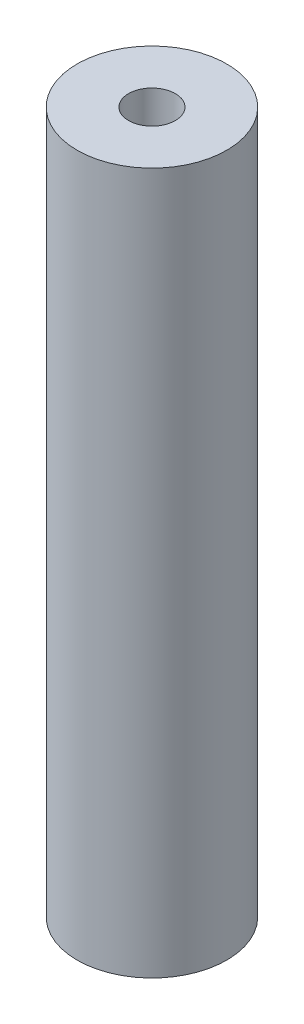
ISO-10303-21;
HEADER;
FILE_DESCRIPTION(('STEP AP214'),'2;1');
FILE_NAME('part.step','',(''),(''),'','','');
FILE_SCHEMA(('AUTOMOTIVE_DESIGN { 1 0 10303 214 1 1 1 1 }'));
ENDSEC;
DATA;
#1=APPLICATION_CONTEXT('core data for automotive mechanical design processes');
#2=APPLICATION_PROTOCOL_DEFINITION('international standard','automotive_design',2000,#1);
#3=PRODUCT_CONTEXT('',#1,'mechanical');
#4=PRODUCT('Part','Part','',(#3));
#5=PRODUCT_RELATED_PRODUCT_CATEGORY('part','',(#4));
#6=PRODUCT_DEFINITION_FORMATION('','',#4);
#7=PRODUCT_DEFINITION_CONTEXT('part definition',#1,'design');
#8=PRODUCT_DEFINITION('design','',#6,#7);
#9=PRODUCT_DEFINITION_SHAPE('','',#8);
#10=(LENGTH_UNIT() NAMED_UNIT(*) SI_UNIT(.MILLI.,.METRE.));
#11=(NAMED_UNIT(*) PLANE_ANGLE_UNIT() SI_UNIT($,.RADIAN.));
#12=(NAMED_UNIT(*) SI_UNIT($,.STERADIAN.) SOLID_ANGLE_UNIT());
#13=UNCERTAINTY_MEASURE_WITH_UNIT(LENGTH_MEASURE(1.E-05),#10,'distance_accuracy_value','');
#14=(GEOMETRIC_REPRESENTATION_CONTEXT(3) GLOBAL_UNCERTAINTY_ASSIGNED_CONTEXT((#13)) GLOBAL_UNIT_ASSIGNED_CONTEXT((#10,
#11,#12)) REPRESENTATION_CONTEXT('',''));
#15=CARTESIAN_POINT('',(0.,0.,0.));
#16=DIRECTION('',(0.,0.,1.));
#17=DIRECTION('',(1.,0.,0.));
#18=AXIS2_PLACEMENT_3D('',#15,#16,#17);
#19=CARTESIAN_POINT('',(0.,37.5,0.));
#20=DIRECTION('',(0.,-1.,0.));
#21=DIRECTION('',(0.,0.,-1.));
#22=AXIS2_PLACEMENT_3D('',#19,#20,#21);
#23=CYLINDRICAL_SURFACE('',#22,8.);
#24=CARTESIAN_POINT('',(0.,37.5,0.));
#25=DIRECTION('',(0.,1.,0.));
#26=DIRECTION('',(0.,0.,1.));
#27=AXIS2_PLACEMENT_3D('',#24,#25,#26);
#28=CIRCLE('',#27,8.);
#29=CARTESIAN_POINT('',(0.,37.5,8.));
#30=VERTEX_POINT('',#29);
#31=EDGE_CURVE('E11',#30,#30,#28,.T.);
#32=ORIENTED_EDGE('',*,*,#31,.F.);
#33=EDGE_LOOP('',(#32));
#34=FACE_BOUND('',#33,.T.);
#35=CARTESIAN_POINT('',(0.,-37.5,0.));
#36=DIRECTION('',(0.,1.,0.));
#37=DIRECTION('',(0.,0.,1.));
#38=AXIS2_PLACEMENT_3D('',#35,#36,#37);
#39=CIRCLE('',#38,8.);
#40=CARTESIAN_POINT('',(0.,-37.5,8.));
#41=VERTEX_POINT('',#40);
#42=EDGE_CURVE('E40',#41,#41,#39,.T.);
#43=ORIENTED_EDGE('',*,*,#42,.T.);
#44=EDGE_LOOP('',(#43));
#45=FACE_BOUND('',#44,.T.);
#46=ADVANCED_FACE('F37',(#34,#45),#23,.T.);
#47=CARTESIAN_POINT('',(0.,37.5,0.));
#48=DIRECTION('',(0.,1.,0.));
#49=DIRECTION('',(0.,0.,1.));
#50=AXIS2_PLACEMENT_3D('',#47,#48,#49);
#51=PLANE('',#50);
#52=CARTESIAN_POINT('',(0.,37.5,0.));
#53=DIRECTION('',(0.,1.,0.));
#54=DIRECTION('',(0.,0.,1.));
#55=AXIS2_PLACEMENT_3D('',#52,#53,#54);
#56=CIRCLE('',#55,2.5);
#57=CARTESIAN_POINT('',(0.,37.5,2.5));
#58=VERTEX_POINT('',#57);
#59=EDGE_CURVE('E60',#58,#58,#56,.T.);
#60=ORIENTED_EDGE('',*,*,#59,.F.);
#61=EDGE_LOOP('',(#60));
#62=FACE_BOUND('',#61,.T.);
#63=ORIENTED_EDGE('',*,*,#31,.T.);
#64=EDGE_LOOP('',(#63));
#65=FACE_BOUND('',#64,.T.);
#66=ADVANCED_FACE('F79',(#62,#65),#51,.T.);
#67=CARTESIAN_POINT('',(0.,-37.5,0.));
#68=DIRECTION('',(0.,1.,0.));
#69=DIRECTION('',(0.,0.,1.));
#70=AXIS2_PLACEMENT_3D('',#67,#68,#69);
#71=PLANE('',#70);
#72=CARTESIAN_POINT('',(0.,-37.5,0.));
#73=DIRECTION('',(0.,-1.,0.));
#74=DIRECTION('',(0.,0.,-1.));
#75=AXIS2_PLACEMENT_3D('',#72,#73,#74);
#76=CIRCLE('',#75,2.5);
#77=CARTESIAN_POINT('',(0.,-37.5,-2.5));
#78=VERTEX_POINT('',#77);
#79=EDGE_CURVE('E61',#78,#78,#76,.T.);
#80=ORIENTED_EDGE('',*,*,#79,.F.);
#81=EDGE_LOOP('',(#80));
#82=FACE_BOUND('',#81,.T.);
#83=ORIENTED_EDGE('',*,*,#42,.F.);
#84=EDGE_LOOP('',(#83));
#85=FACE_BOUND('',#84,.T.);
#86=ADVANCED_FACE('F76',(#82,#85),#71,.F.);
#87=CARTESIAN_POINT('',(0.,20.5,0.));
#88=DIRECTION('',(0.,1.,0.));
#89=DIRECTION('',(0.,0.,1.));
#90=AXIS2_PLACEMENT_3D('',#87,#88,#89);
#91=CONICAL_SURFACE('',#90,2.5,1.02974425867665);
#92=CARTESIAN_POINT('',(0.,18.9978484524311,0.));
#93=VERTEX_POINT('',#92);
#94=VERTEX_LOOP('',#93);
#95=FACE_BOUND('',#94,.T.);
#96=CARTESIAN_POINT('',(0.,20.5,0.));
#97=DIRECTION('',(0.,1.,0.));
#98=DIRECTION('',(0.,0.,1.));
#99=AXIS2_PLACEMENT_3D('',#96,#97,#98);
#100=CIRCLE('',#99,2.5);
#101=CARTESIAN_POINT('',(0.,20.5,2.5));
#102=VERTEX_POINT('',#101);
#103=EDGE_CURVE('E64',#102,#102,#100,.T.);
#104=ORIENTED_EDGE('',*,*,#103,.T.);
#105=EDGE_LOOP('',(#104));
#106=FACE_BOUND('',#105,.T.);
#107=ADVANCED_FACE('F78',(#95,#106),#91,.F.);
#108=CARTESIAN_POINT('',(0.,37.5,0.));
#109=DIRECTION('',(0.,1.,0.));
#110=DIRECTION('',(0.,0.,1.));
#111=AXIS2_PLACEMENT_3D('',#108,#109,#110);
#112=CYLINDRICAL_SURFACE('',#111,2.5);
#113=ORIENTED_EDGE('',*,*,#103,.F.);
#114=EDGE_LOOP('',(#113));
#115=FACE_BOUND('',#114,.T.);
#116=ORIENTED_EDGE('',*,*,#59,.T.);
#117=EDGE_LOOP('',(#116));
#118=FACE_BOUND('',#117,.T.);
#119=ADVANCED_FACE('F54',(#115,#118),#112,.F.);
#120=CARTESIAN_POINT('',(0.,-20.5,0.));
#121=DIRECTION('',(0.,-1.,0.));
#122=DIRECTION('',(0.,0.,-1.));
#123=AXIS2_PLACEMENT_3D('',#120,#121,#122);
#124=CONICAL_SURFACE('',#123,2.5,1.02974425867665);
#125=CARTESIAN_POINT('',(0.,-18.9978484524311,0.));
#126=VERTEX_POINT('',#125);
#127=VERTEX_LOOP('',#126);
#128=FACE_BOUND('',#127,.T.);
#129=CARTESIAN_POINT('',(0.,-20.5,0.));
#130=DIRECTION('',(0.,-1.,0.));
#131=DIRECTION('',(0.,0.,-1.));
#132=AXIS2_PLACEMENT_3D('',#129,#130,#131);
#133=CIRCLE('',#132,2.5);
#134=CARTESIAN_POINT('',(0.,-20.5,-2.5));
#135=VERTEX_POINT('',#134);
#136=EDGE_CURVE('E58',#135,#135,#133,.T.);
#137=ORIENTED_EDGE('',*,*,#136,.T.);
#138=EDGE_LOOP('',(#137));
#139=FACE_BOUND('',#138,.T.);
#140=ADVANCED_FACE('F50',(#128,#139),#124,.F.);
#141=CARTESIAN_POINT('',(0.,-37.5,0.));
#142=DIRECTION('',(0.,-1.,0.));
#143=DIRECTION('',(0.,0.,-1.));
#144=AXIS2_PLACEMENT_3D('',#141,#142,#143);
#145=CYLINDRICAL_SURFACE('',#144,2.5);
#146=ORIENTED_EDGE('',*,*,#136,.F.);
#147=EDGE_LOOP('',(#146));
#148=FACE_BOUND('',#147,.T.);
#149=ORIENTED_EDGE('',*,*,#79,.T.);
#150=EDGE_LOOP('',(#149));
#151=FACE_BOUND('',#150,.T.);
#152=ADVANCED_FACE('F53',(#148,#151),#145,.F.);
#153=CLOSED_SHELL('',(#46,#66,#86,#107,#119,#140,#152));
#154=MANIFOLD_SOLID_BREP('B2',#153);
#155=ADVANCED_BREP_SHAPE_REPRESENTATION('',(#18,#154),#14);
#156=SHAPE_DEFINITION_REPRESENTATION(#9,#155);
ENDSEC;
END-ISO-10303-21;
